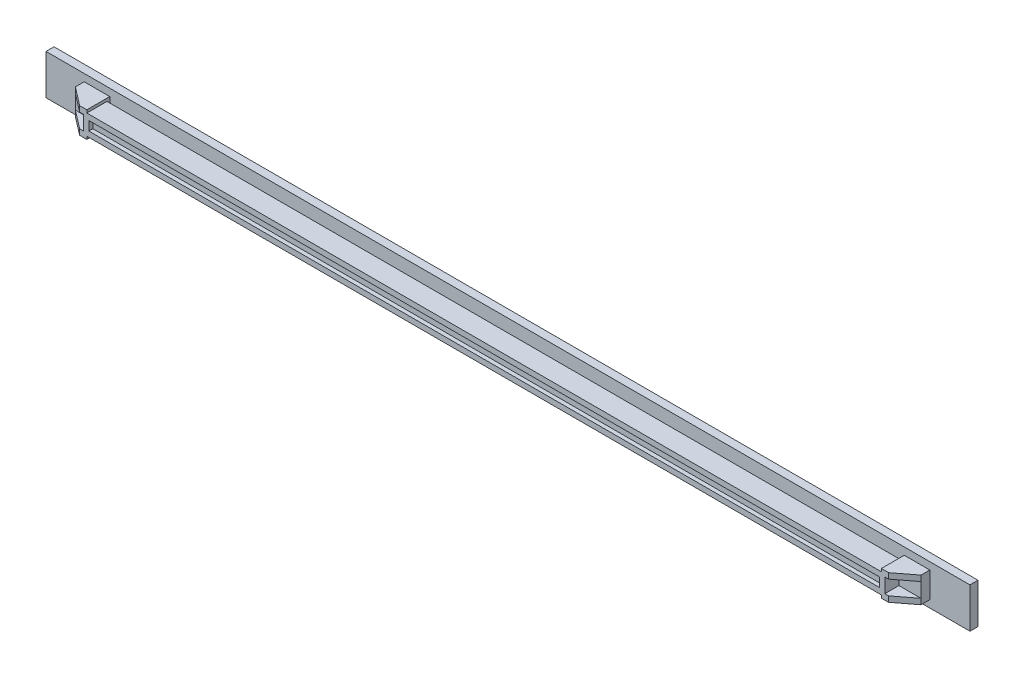
ISO-10303-21;
HEADER;
FILE_DESCRIPTION(('STEP AP214'),'2;1');
FILE_NAME('part.step','',(''),(''),'','','');
FILE_SCHEMA(('AUTOMOTIVE_DESIGN { 1 0 10303 214 1 1 1 1 }'));
ENDSEC;
DATA;
#1=APPLICATION_CONTEXT('core data for automotive mechanical design processes');
#2=APPLICATION_PROTOCOL_DEFINITION('international standard','automotive_design',2000,#1);
#3=PRODUCT_CONTEXT('',#1,'mechanical');
#4=PRODUCT('Part','Part','',(#3));
#5=PRODUCT_RELATED_PRODUCT_CATEGORY('part','',(#4));
#6=PRODUCT_DEFINITION_FORMATION('','',#4);
#7=PRODUCT_DEFINITION_CONTEXT('part definition',#1,'design');
#8=PRODUCT_DEFINITION('design','',#6,#7);
#9=PRODUCT_DEFINITION_SHAPE('','',#8);
#10=(LENGTH_UNIT() NAMED_UNIT(*) SI_UNIT(.MILLI.,.METRE.));
#11=(NAMED_UNIT(*) PLANE_ANGLE_UNIT() SI_UNIT($,.RADIAN.));
#12=(NAMED_UNIT(*) SI_UNIT($,.STERADIAN.) SOLID_ANGLE_UNIT());
#13=UNCERTAINTY_MEASURE_WITH_UNIT(LENGTH_MEASURE(1.E-05),#10,'distance_accuracy_value','');
#14=(GEOMETRIC_REPRESENTATION_CONTEXT(3) GLOBAL_UNCERTAINTY_ASSIGNED_CONTEXT((#13)) GLOBAL_UNIT_ASSIGNED_CONTEXT((#10,
#11,#12)) REPRESENTATION_CONTEXT('',''));
#15=CARTESIAN_POINT('',(0.,0.,0.));
#16=DIRECTION('',(0.,0.,1.));
#17=DIRECTION('',(1.,0.,0.));
#18=AXIS2_PLACEMENT_3D('',#15,#16,#17);
#19=CARTESIAN_POINT('',(1077.4481005517,37.5000000000001,-3.5));
#20=DIRECTION('',(0.,0.,-1.));
#21=DIRECTION('',(-1.,0.,0.));
#22=AXIS2_PLACEMENT_3D('',#19,#20,#21);
#23=PLANE('',#22);
#24=DIRECTION('',(-1.,0.,0.));
#25=VECTOR('',#24,1.);
#26=CARTESIAN_POINT('',(1077.4481005517,37.5000000000001,-3.5));
#27=LINE('',#26,#25);
#28=CARTESIAN_POINT('',(1077.4481005517,37.5000000000001,-3.5));
#29=VERTEX_POINT('',#28);
#30=CARTESIAN_POINT('',(-72.551899448297,37.4999999999999,-3.5));
#31=VERTEX_POINT('',#30);
#32=EDGE_CURVE('E101',#29,#31,#27,.T.);
#33=ORIENTED_EDGE('',*,*,#32,.T.);
#34=DIRECTION('',(0.,-1.,0.));
#35=VECTOR('',#34,1.);
#36=CARTESIAN_POINT('',(-72.551899448297,37.4999999999999,-3.5));
#37=LINE('',#36,#35);
#38=CARTESIAN_POINT('',(-72.551899448297,-12.5000000000001,-3.5));
#39=VERTEX_POINT('',#38);
#40=EDGE_CURVE('E96',#31,#39,#37,.T.);
#41=ORIENTED_EDGE('',*,*,#40,.T.);
#42=DIRECTION('',(-1.,0.,0.));
#43=VECTOR('',#42,1.);
#44=CARTESIAN_POINT('',(1077.4481005517,-12.4999999999999,-3.5));
#45=LINE('',#44,#43);
#46=CARTESIAN_POINT('',(1077.4481005517,-12.4999999999999,-3.5));
#47=VERTEX_POINT('',#46);
#48=EDGE_CURVE('E12',#47,#39,#45,.T.);
#49=ORIENTED_EDGE('',*,*,#48,.F.);
#50=DIRECTION('',(0.,-1.,0.));
#51=VECTOR('',#50,1.);
#52=CARTESIAN_POINT('',(1077.4481005517,37.5000000000001,-3.5));
#53=LINE('',#52,#51);
#54=EDGE_CURVE('E107',#29,#47,#53,.T.);
#55=ORIENTED_EDGE('',*,*,#54,.F.);
#56=EDGE_LOOP('',(#33,#41,#49,#55));
#57=FACE_BOUND('',#56,.T.);
#58=ADVANCED_FACE('F44',(#57),#23,.F.);
#59=CARTESIAN_POINT('',(1077.4481005517,-12.4999999999999,-3.5));
#60=DIRECTION('',(0.,1.,0.));
#61=DIRECTION('',(-1.,0.,0.));
#62=AXIS2_PLACEMENT_3D('',#59,#60,#61);
#63=PLANE('',#62);
#64=ORIENTED_EDGE('',*,*,#48,.T.);
#65=DIRECTION('',(0.,0.,-1.));
#66=VECTOR('',#65,1.);
#67=CARTESIAN_POINT('',(-72.551899448297,-12.5000000000001,-3.5));
#68=LINE('',#67,#66);
#69=CARTESIAN_POINT('',(-72.551899448297,-12.5000000000001,-13.5));
#70=VERTEX_POINT('',#69);
#71=EDGE_CURVE('E86',#39,#70,#68,.T.);
#72=ORIENTED_EDGE('',*,*,#71,.T.);
#73=DIRECTION('',(-1.,0.,0.));
#74=VECTOR('',#73,1.);
#75=CARTESIAN_POINT('',(1077.4481005517,-12.4999999999999,-13.5));
#76=LINE('',#75,#74);
#77=CARTESIAN_POINT('',(1077.4481005517,-12.4999999999999,-13.5));
#78=VERTEX_POINT('',#77);
#79=EDGE_CURVE('E51',#78,#70,#76,.T.);
#80=ORIENTED_EDGE('',*,*,#79,.F.);
#81=DIRECTION('',(0.,0.,-1.));
#82=VECTOR('',#81,1.);
#83=CARTESIAN_POINT('',(1077.4481005517,-12.4999999999999,-3.5));
#84=LINE('',#83,#82);
#85=EDGE_CURVE('E87',#47,#78,#84,.T.);
#86=ORIENTED_EDGE('',*,*,#85,.F.);
#87=EDGE_LOOP('',(#64,#72,#80,#86));
#88=FACE_BOUND('',#87,.T.);
#89=ADVANCED_FACE('F84',(#88),#63,.F.);
#90=CARTESIAN_POINT('',(1077.4481005517,37.5000000000001,-13.5));
#91=DIRECTION('',(0.,0.,1.));
#92=DIRECTION('',(1.,0.,0.));
#93=AXIS2_PLACEMENT_3D('',#90,#91,#92);
#94=PLANE('',#93);
#95=ORIENTED_EDGE('',*,*,#79,.T.);
#96=DIRECTION('',(0.,1.,0.));
#97=VECTOR('',#96,1.);
#98=CARTESIAN_POINT('',(-72.551899448297,37.4999999999999,-13.5));
#99=LINE('',#98,#97);
#100=CARTESIAN_POINT('',(-72.551899448297,37.4999999999999,-13.5));
#101=VERTEX_POINT('',#100);
#102=EDGE_CURVE('E99',#70,#101,#99,.T.);
#103=ORIENTED_EDGE('',*,*,#102,.T.);
#104=DIRECTION('',(-1.,0.,0.));
#105=VECTOR('',#104,1.);
#106=CARTESIAN_POINT('',(1077.4481005517,37.5000000000001,-13.5));
#107=LINE('',#106,#105);
#108=CARTESIAN_POINT('',(1077.4481005517,37.5000000000001,-13.5));
#109=VERTEX_POINT('',#108);
#110=EDGE_CURVE('E113',#109,#101,#107,.T.);
#111=ORIENTED_EDGE('',*,*,#110,.F.);
#112=DIRECTION('',(0.,1.,0.));
#113=VECTOR('',#112,1.);
#114=CARTESIAN_POINT('',(1077.4481005517,37.5000000000001,-13.5));
#115=LINE('',#114,#113);
#116=EDGE_CURVE('E63',#78,#109,#115,.T.);
#117=ORIENTED_EDGE('',*,*,#116,.F.);
#118=EDGE_LOOP('',(#95,#103,#111,#117));
#119=FACE_BOUND('',#118,.T.);
#120=ADVANCED_FACE('F115',(#119),#94,.F.);
#121=CARTESIAN_POINT('',(1077.4481005517,37.5000000000001,-3.5));
#122=DIRECTION('',(0.,-1.,0.));
#123=DIRECTION('',(1.,0.,0.));
#124=AXIS2_PLACEMENT_3D('',#121,#122,#123);
#125=PLANE('',#124);
#126=ORIENTED_EDGE('',*,*,#110,.T.);
#127=DIRECTION('',(0.,0.,1.));
#128=VECTOR('',#127,1.);
#129=CARTESIAN_POINT('',(-72.551899448297,37.4999999999999,-3.5));
#130=LINE('',#129,#128);
#131=EDGE_CURVE('E105',#101,#31,#130,.T.);
#132=ORIENTED_EDGE('',*,*,#131,.T.);
#133=ORIENTED_EDGE('',*,*,#32,.F.);
#134=DIRECTION('',(0.,0.,1.));
#135=VECTOR('',#134,1.);
#136=CARTESIAN_POINT('',(1077.4481005517,37.5000000000001,-3.5));
#137=LINE('',#136,#135);
#138=EDGE_CURVE('E58',#109,#29,#137,.T.);
#139=ORIENTED_EDGE('',*,*,#138,.F.);
#140=EDGE_LOOP('',(#126,#132,#133,#139));
#141=FACE_BOUND('',#140,.T.);
#142=ADVANCED_FACE('F117',(#141),#125,.F.);
#143=CARTESIAN_POINT('',(1077.4481005517,0.,0.));
#144=DIRECTION('',(1.,0.,0.));
#145=DIRECTION('',(0.,0.,-1.));
#146=AXIS2_PLACEMENT_3D('',#143,#144,#145);
#147=PLANE('',#146);
#148=ORIENTED_EDGE('',*,*,#54,.T.);
#149=ORIENTED_EDGE('',*,*,#85,.T.);
#150=ORIENTED_EDGE('',*,*,#116,.T.);
#151=ORIENTED_EDGE('',*,*,#138,.T.);
#152=EDGE_LOOP('',(#148,#149,#150,#151));
#153=FACE_BOUND('',#152,.T.);
#154=ADVANCED_FACE('F118',(#153),#147,.T.);
#155=CARTESIAN_POINT('',(-72.551899448297,-1.32513598859339E-13,0.));
#156=DIRECTION('',(1.,0.,0.));
#157=DIRECTION('',(0.,0.,-1.));
#158=AXIS2_PLACEMENT_3D('',#155,#156,#157);
#159=PLANE('',#158);
#160=ORIENTED_EDGE('',*,*,#40,.F.);
#161=ORIENTED_EDGE('',*,*,#131,.F.);
#162=ORIENTED_EDGE('',*,*,#102,.F.);
#163=ORIENTED_EDGE('',*,*,#71,.F.);
#164=EDGE_LOOP('',(#160,#161,#162,#163));
#165=FACE_BOUND('',#164,.T.);
#166=ADVANCED_FACE('F94',(#165),#159,.F.);
#167=CLOSED_SHELL('',(#58,#89,#120,#142,#154,#166));
#168=MANIFOLD_SOLID_BREP('B2',#167);
#169=CARTESIAN_POINT('',(0.,0.,25.));
#170=DIRECTION('',(0.,1.,0.));
#171=DIRECTION('',(0.,0.,1.));
#172=AXIS2_PLACEMENT_3D('',#169,#170,#171);
#173=PLANE('',#172);
#174=DIRECTION('',(0.,0.,-1.));
#175=VECTOR('',#174,1.);
#176=CARTESIAN_POINT('',(995.648100551703,0.,25.));
#177=LINE('',#176,#175);
#178=CARTESIAN_POINT('',(995.648100551703,0.,25.));
#179=VERTEX_POINT('',#178);
#180=CARTESIAN_POINT('',(995.648100551703,0.,0.));
#181=VERTEX_POINT('',#180);
#182=EDGE_CURVE('E181',#179,#181,#177,.T.);
#183=ORIENTED_EDGE('',*,*,#182,.F.);
#184=DIRECTION('',(1.,0.,0.));
#185=VECTOR('',#184,1.);
#186=CARTESIAN_POINT('',(0.,0.,25.));
#187=LINE('',#186,#185);
#188=CARTESIAN_POINT('',(6.8,0.,25.));
#189=VERTEX_POINT('',#188);
#190=EDGE_CURVE('E539',#189,#179,#187,.T.);
#191=ORIENTED_EDGE('',*,*,#190,.F.);
#192=DIRECTION('',(0.,0.,-1.));
#193=VECTOR('',#192,1.);
#194=CARTESIAN_POINT('',(6.8,0.,25.));
#195=LINE('',#194,#193);
#196=CARTESIAN_POINT('',(6.8,0.,0.));
#197=VERTEX_POINT('',#196);
#198=EDGE_CURVE('E492',#189,#197,#195,.T.);
#199=ORIENTED_EDGE('',*,*,#198,.T.);
#200=DIRECTION('',(1.,0.,0.));
#201=VECTOR('',#200,1.);
#202=CARTESIAN_POINT('',(0.,0.,0.));
#203=LINE('',#202,#201);
#204=EDGE_CURVE('E536',#197,#181,#203,.T.);
#205=ORIENTED_EDGE('',*,*,#204,.T.);
#206=EDGE_LOOP('',(#183,#191,#199,#205));
#207=FACE_BOUND('',#206,.T.);
#208=ADVANCED_FACE('F167',(#207),#173,.F.);
#209=CARTESIAN_POINT('',(0.,25.,25.));
#210=DIRECTION('',(0.,-1.,0.));
#211=DIRECTION('',(0.,0.,-1.));
#212=AXIS2_PLACEMENT_3D('',#209,#210,#211);
#213=PLANE('',#212);
#214=DIRECTION('',(0.,0.,1.));
#215=VECTOR('',#214,1.);
#216=CARTESIAN_POINT('',(995.648100551703,25.0000000000001,0.));
#217=LINE('',#216,#215);
#218=CARTESIAN_POINT('',(995.648100551703,25.0000000000001,0.));
#219=VERTEX_POINT('',#218);
#220=CARTESIAN_POINT('',(995.648100551703,25.0000000000001,25.));
#221=VERTEX_POINT('',#220);
#222=EDGE_CURVE('E404',#219,#221,#217,.T.);
#223=ORIENTED_EDGE('',*,*,#222,.F.);
#224=DIRECTION('',(-1.,0.,0.));
#225=VECTOR('',#224,1.);
#226=CARTESIAN_POINT('',(0.,25.,0.));
#227=LINE('',#226,#225);
#228=CARTESIAN_POINT('',(6.8,25.,0.));
#229=VERTEX_POINT('',#228);
#230=EDGE_CURVE('E541',#219,#229,#227,.T.);
#231=ORIENTED_EDGE('',*,*,#230,.T.);
#232=DIRECTION('',(0.,0.,1.));
#233=VECTOR('',#232,1.);
#234=CARTESIAN_POINT('',(6.8,25.,0.));
#235=LINE('',#234,#233);
#236=CARTESIAN_POINT('',(6.8,25.,25.));
#237=VERTEX_POINT('',#236);
#238=EDGE_CURVE('E487',#229,#237,#235,.T.);
#239=ORIENTED_EDGE('',*,*,#238,.T.);
#240=DIRECTION('',(-1.,0.,0.));
#241=VECTOR('',#240,1.);
#242=CARTESIAN_POINT('',(0.,25.,25.));
#243=LINE('',#242,#241);
#244=EDGE_CURVE('E543',#221,#237,#243,.T.);
#245=ORIENTED_EDGE('',*,*,#244,.F.);
#246=EDGE_LOOP('',(#223,#231,#239,#245));
#247=FACE_BOUND('',#246,.T.);
#248=ADVANCED_FACE('F626',(#247),#213,.F.);
#249=CARTESIAN_POINT('',(0.,0.,0.));
#250=DIRECTION('',(0.,0.,-1.));
#251=DIRECTION('',(-1.,0.,0.));
#252=AXIS2_PLACEMENT_3D('',#249,#250,#251);
#253=PLANE('',#252);
#254=ORIENTED_EDGE('',*,*,#230,.F.);
#255=DIRECTION('',(0.,1.,0.));
#256=VECTOR('',#255,1.);
#257=CARTESIAN_POINT('',(995.648100551703,0.,0.));
#258=LINE('',#257,#256);
#259=EDGE_CURVE('E409',#181,#219,#258,.T.);
#260=ORIENTED_EDGE('',*,*,#259,.F.);
#261=ORIENTED_EDGE('',*,*,#204,.F.);
#262=DIRECTION('',(0.,1.,0.));
#263=VECTOR('',#262,1.);
#264=CARTESIAN_POINT('',(6.8,0.,0.));
#265=LINE('',#264,#263);
#266=EDGE_CURVE('E495',#197,#229,#265,.T.);
#267=ORIENTED_EDGE('',*,*,#266,.T.);
#268=EDGE_LOOP('',(#254,#260,#261,#267));
#269=FACE_BOUND('',#268,.T.);
#270=ADVANCED_FACE('F630',(#269),#253,.T.);
#271=CARTESIAN_POINT('',(993.2,18.2000000000002,20.));
#272=DIRECTION('',(0.,1.,0.));
#273=DIRECTION('',(-1.,0.,0.));
#274=AXIS2_PLACEMENT_3D('',#271,#272,#273);
#275=PLANE('',#274);
#276=DIRECTION('',(-1.,0.,0.));
#277=VECTOR('',#276,1.);
#278=CARTESIAN_POINT('',(993.2,18.2000000000002,25.));
#279=LINE('',#278,#277);
#280=CARTESIAN_POINT('',(993.2,18.2000000000002,25.));
#281=VERTEX_POINT('',#280);
#282=CARTESIAN_POINT('',(9.24810055170333,18.2000000000001,25.));
#283=VERTEX_POINT('',#282);
#284=EDGE_CURVE('E519',#281,#283,#279,.T.);
#285=ORIENTED_EDGE('',*,*,#284,.T.);
#286=DIRECTION('',(0.,0.,1.));
#287=VECTOR('',#286,1.);
#288=CARTESIAN_POINT('',(9.24810055170333,18.2000000000001,20.));
#289=LINE('',#288,#287);
#290=CARTESIAN_POINT('',(9.24810055170333,18.2,20.));
#291=VERTEX_POINT('',#290);
#292=EDGE_CURVE('E352',#291,#283,#289,.T.);
#293=ORIENTED_EDGE('',*,*,#292,.F.);
#294=DIRECTION('',(-1.,0.,0.));
#295=VECTOR('',#294,1.);
#296=CARTESIAN_POINT('',(993.2,18.2000000000002,20.));
#297=LINE('',#296,#295);
#298=CARTESIAN_POINT('',(993.2,18.2000000000002,20.));
#299=VERTEX_POINT('',#298);
#300=EDGE_CURVE('E520',#299,#291,#297,.T.);
#301=ORIENTED_EDGE('',*,*,#300,.F.);
#302=DIRECTION('',(0.,0.,1.));
#303=VECTOR('',#302,1.);
#304=CARTESIAN_POINT('',(993.2,18.2000000000002,20.));
#305=LINE('',#304,#303);
#306=EDGE_CURVE('E534',#299,#281,#305,.T.);
#307=ORIENTED_EDGE('',*,*,#306,.T.);
#308=EDGE_LOOP('',(#285,#293,#301,#307));
#309=FACE_BOUND('',#308,.T.);
#310=ADVANCED_FACE('F636',(#309),#275,.F.);
#311=CARTESIAN_POINT('',(6.8,6.8,20.));
#312=DIRECTION('',(0.,-1.,0.));
#313=DIRECTION('',(1.,0.,0.));
#314=AXIS2_PLACEMENT_3D('',#311,#312,#313);
#315=PLANE('',#314);
#316=DIRECTION('',(1.,0.,0.));
#317=VECTOR('',#316,1.);
#318=CARTESIAN_POINT('',(6.8,6.8,25.));
#319=LINE('',#318,#317);
#320=CARTESIAN_POINT('',(9.24810055170333,6.8,25.));
#321=VERTEX_POINT('',#320);
#322=CARTESIAN_POINT('',(993.2,6.80000000000006,25.));
#323=VERTEX_POINT('',#322);
#324=EDGE_CURVE('E530',#321,#323,#319,.T.);
#325=ORIENTED_EDGE('',*,*,#324,.T.);
#326=DIRECTION('',(0.,0.,1.));
#327=VECTOR('',#326,1.);
#328=CARTESIAN_POINT('',(993.2,6.80000000000006,20.));
#329=LINE('',#328,#327);
#330=CARTESIAN_POINT('',(993.2,6.80000000000006,20.));
#331=VERTEX_POINT('',#330);
#332=EDGE_CURVE('E528',#331,#323,#329,.T.);
#333=ORIENTED_EDGE('',*,*,#332,.F.);
#334=DIRECTION('',(1.,0.,0.));
#335=VECTOR('',#334,1.);
#336=CARTESIAN_POINT('',(6.8,6.8,20.));
#337=LINE('',#336,#335);
#338=CARTESIAN_POINT('',(9.24810055170333,6.8,20.));
#339=VERTEX_POINT('',#338);
#340=EDGE_CURVE('E522',#339,#331,#337,.T.);
#341=ORIENTED_EDGE('',*,*,#340,.F.);
#342=DIRECTION('',(0.,0.,1.));
#343=VECTOR('',#342,1.);
#344=CARTESIAN_POINT('',(9.24810055170333,6.8,20.));
#345=LINE('',#344,#343);
#346=EDGE_CURVE('E435',#339,#321,#345,.T.);
#347=ORIENTED_EDGE('',*,*,#346,.T.);
#348=EDGE_LOOP('',(#325,#333,#341,#347));
#349=FACE_BOUND('',#348,.T.);
#350=ADVANCED_FACE('F666',(#349),#315,.F.);
#351=CARTESIAN_POINT('',(0.,0.,20.));
#352=DIRECTION('',(0.,0.,1.));
#353=DIRECTION('',(1.,0.,0.));
#354=AXIS2_PLACEMENT_3D('',#351,#352,#353);
#355=PLANE('',#354);
#356=ORIENTED_EDGE('',*,*,#300,.T.);
#357=DIRECTION('',(0.,1.,0.));
#358=VECTOR('',#357,1.);
#359=CARTESIAN_POINT('',(9.24810055170333,6.8,20.));
#360=LINE('',#359,#358);
#361=EDGE_CURVE('E189',#339,#291,#360,.T.);
#362=ORIENTED_EDGE('',*,*,#361,.F.);
#363=ORIENTED_EDGE('',*,*,#340,.T.);
#364=DIRECTION('',(0.,1.,0.));
#365=VECTOR('',#364,1.);
#366=CARTESIAN_POINT('',(993.2,6.80000000000006,20.));
#367=LINE('',#366,#365);
#368=EDGE_CURVE('E525',#331,#299,#367,.T.);
#369=ORIENTED_EDGE('',*,*,#368,.T.);
#370=EDGE_LOOP('',(#356,#362,#363,#369));
#371=FACE_BOUND('',#370,.T.);
#372=ADVANCED_FACE('F657',(#371),#355,.T.);
#373=CARTESIAN_POINT('',(-25.,28.5,28.5));
#374=DIRECTION('',(0.,-1.,0.));
#375=DIRECTION('',(0.,0.,-1.));
#376=AXIS2_PLACEMENT_3D('',#373,#374,#375);
#377=PLANE('',#376);
#378=DIRECTION('',(-1.,0.,0.));
#379=VECTOR('',#378,1.);
#380=CARTESIAN_POINT('',(-25.,28.5,25.));
#381=LINE('',#380,#379);
#382=CARTESIAN_POINT('',(6.79999999999999,28.5,25.));
#383=VERTEX_POINT('',#382);
#384=CARTESIAN_POINT('',(-2.12658287358067,28.5,25.));
#385=VERTEX_POINT('',#384);
#386=EDGE_CURVE('E446',#383,#385,#381,.T.);
#387=ORIENTED_EDGE('',*,*,#386,.F.);
#388=DIRECTION('',(0.,0.,1.));
#389=VECTOR('',#388,1.);
#390=CARTESIAN_POINT('',(6.8,28.5,-3.5));
#391=LINE('',#390,#389);
#392=CARTESIAN_POINT('',(6.8,28.5,-3.5));
#393=VERTEX_POINT('',#392);
#394=EDGE_CURVE('E503',#393,#383,#391,.T.);
#395=ORIENTED_EDGE('',*,*,#394,.F.);
#396=DIRECTION('',(1.,0.,0.));
#397=VECTOR('',#396,1.);
#398=CARTESIAN_POINT('',(-25.,28.5,-3.5));
#399=LINE('',#398,#397);
#400=CARTESIAN_POINT('',(-25.,28.5,-3.5));
#401=VERTEX_POINT('',#400);
#402=EDGE_CURVE('E514',#401,#393,#399,.T.);
#403=ORIENTED_EDGE('',*,*,#402,.F.);
#404=DIRECTION('',(0.,0.,-1.));
#405=VECTOR('',#404,1.);
#406=CARTESIAN_POINT('',(-25.,28.5,28.5));
#407=LINE('',#406,#405);
#408=CARTESIAN_POINT('',(-25.,28.5,7.5));
#409=VERTEX_POINT('',#408);
#410=EDGE_CURVE('E512',#409,#401,#407,.T.);
#411=ORIENTED_EDGE('',*,*,#410,.F.);
#412=DIRECTION('',(-0.794214335112172,0.,-0.607637712705796));
#413=VECTOR('',#412,1.);
#414=CARTESIAN_POINT('',(-14.8655137783,28.5,15.2536953879489));
#415=LINE('',#414,#413);
#416=EDGE_CURVE('E469',#385,#409,#415,.T.);
#417=ORIENTED_EDGE('',*,*,#416,.F.);
#418=EDGE_LOOP('',(#387,#395,#403,#411,#417));
#419=FACE_BOUND('',#418,.T.);
#420=ADVANCED_FACE('F557',(#419),#377,.F.);
#421=CARTESIAN_POINT('',(-25.,-3.50000000000001,-3.5));
#422=DIRECTION('',(0.,1.,0.));
#423=DIRECTION('',(0.,0.,1.));
#424=AXIS2_PLACEMENT_3D('',#421,#422,#423);
#425=PLANE('',#424);
#426=DIRECTION('',(1.,0.,0.));
#427=VECTOR('',#426,1.);
#428=CARTESIAN_POINT('',(-25.,-3.50000000000001,25.));
#429=LINE('',#428,#427);
#430=CARTESIAN_POINT('',(-2.12658287358067,-3.5,25.));
#431=VERTEX_POINT('',#430);
#432=CARTESIAN_POINT('',(6.8,-3.50000000000001,25.));
#433=VERTEX_POINT('',#432);
#434=EDGE_CURVE('E452',#431,#433,#429,.T.);
#435=ORIENTED_EDGE('',*,*,#434,.F.);
#436=DIRECTION('',(-0.794214335112172,0.,-0.607637712705796));
#437=VECTOR('',#436,1.);
#438=CARTESIAN_POINT('',(-12.8500491124511,-3.50000000000001,16.7956876253754));
#439=LINE('',#438,#437);
#440=CARTESIAN_POINT('',(-25.,-3.50000000000001,7.5));
#441=VERTEX_POINT('',#440);
#442=EDGE_CURVE('E458',#431,#441,#439,.T.);
#443=ORIENTED_EDGE('',*,*,#442,.T.);
#444=DIRECTION('',(0.,0.,1.));
#445=VECTOR('',#444,1.);
#446=CARTESIAN_POINT('',(-25.,-3.50000000000001,-3.5));
#447=LINE('',#446,#445);
#448=CARTESIAN_POINT('',(-25.,-3.50000000000001,-3.5));
#449=VERTEX_POINT('',#448);
#450=EDGE_CURVE('E509',#449,#441,#447,.T.);
#451=ORIENTED_EDGE('',*,*,#450,.F.);
#452=DIRECTION('',(1.,0.,0.));
#453=VECTOR('',#452,1.);
#454=CARTESIAN_POINT('',(-25.,-3.50000000000001,-3.5));
#455=LINE('',#454,#453);
#456=CARTESIAN_POINT('',(6.8,-3.5,-3.5));
#457=VERTEX_POINT('',#456);
#458=EDGE_CURVE('E516',#449,#457,#455,.T.);
#459=ORIENTED_EDGE('',*,*,#458,.T.);
#460=DIRECTION('',(0.,0.,-1.));
#461=VECTOR('',#460,1.);
#462=CARTESIAN_POINT('',(6.8,-3.5,28.5));
#463=LINE('',#462,#461);
#464=EDGE_CURVE('E498',#433,#457,#463,.T.);
#465=ORIENTED_EDGE('',*,*,#464,.F.);
#466=EDGE_LOOP('',(#435,#443,#451,#459,#465));
#467=FACE_BOUND('',#466,.T.);
#468=ADVANCED_FACE('F584',(#467),#425,.F.);
#469=CARTESIAN_POINT('',(-25.,21.5,7.5));
#470=DIRECTION('',(0.,1.,0.));
#471=DIRECTION('',(0.,0.,1.));
#472=AXIS2_PLACEMENT_3D('',#469,#470,#471);
#473=PLANE('',#472);
#474=DIRECTION('',(1.,0.,0.));
#475=VECTOR('',#474,1.);
#476=CARTESIAN_POINT('',(-25.,21.5,25.));
#477=LINE('',#476,#475);
#478=CARTESIAN_POINT('',(-2.12658287358067,21.5,25.));
#479=VERTEX_POINT('',#478);
#480=CARTESIAN_POINT('',(2.44810055170319,21.5,25.));
#481=VERTEX_POINT('',#480);
#482=EDGE_CURVE('E443',#479,#481,#477,.T.);
#483=ORIENTED_EDGE('',*,*,#482,.F.);
#484=DIRECTION('',(0.794214335112172,0.,0.607637712705796));
#485=VECTOR('',#484,1.);
#486=CARTESIAN_POINT('',(-25.,21.5,7.49999999999999));
#487=LINE('',#486,#485);
#488=CARTESIAN_POINT('',(-25.,21.5,7.5));
#489=VERTEX_POINT('',#488);
#490=EDGE_CURVE('E466',#489,#479,#487,.T.);
#491=ORIENTED_EDGE('',*,*,#490,.F.);
#492=DIRECTION('',(-1.,0.,0.));
#493=VECTOR('',#492,1.);
#494=CARTESIAN_POINT('',(-25.,21.5,7.5));
#495=LINE('',#494,#493);
#496=CARTESIAN_POINT('',(2.44810055170319,21.5,7.5));
#497=VERTEX_POINT('',#496);
#498=EDGE_CURVE('E480',#497,#489,#495,.T.);
#499=ORIENTED_EDGE('',*,*,#498,.F.);
#500=DIRECTION('',(0.,0.,1.));
#501=VECTOR('',#500,1.);
#502=CARTESIAN_POINT('',(2.44810055170319,21.5,7.5));
#503=LINE('',#502,#501);
#504=EDGE_CURVE('E484',#497,#481,#503,.T.);
#505=ORIENTED_EDGE('',*,*,#504,.T.);
#506=EDGE_LOOP('',(#483,#491,#499,#505));
#507=FACE_BOUND('',#506,.T.);
#508=ADVANCED_FACE('F568',(#507),#473,.F.);
#509=CARTESIAN_POINT('',(-25.,3.49999999999999,7.5));
#510=DIRECTION('',(0.,-1.,0.));
#511=DIRECTION('',(0.,0.,-1.));
#512=AXIS2_PLACEMENT_3D('',#509,#510,#511);
#513=PLANE('',#512);
#514=DIRECTION('',(-1.,0.,0.));
#515=VECTOR('',#514,1.);
#516=CARTESIAN_POINT('',(-25.,3.49999999999999,25.));
#517=LINE('',#516,#515);
#518=CARTESIAN_POINT('',(2.44810055170319,3.49999999999999,25.));
#519=VERTEX_POINT('',#518);
#520=CARTESIAN_POINT('',(-2.12658287358067,3.5,25.));
#521=VERTEX_POINT('',#520);
#522=EDGE_CURVE('E450',#519,#521,#517,.T.);
#523=ORIENTED_EDGE('',*,*,#522,.F.);
#524=DIRECTION('',(0.,0.,1.));
#525=VECTOR('',#524,1.);
#526=CARTESIAN_POINT('',(2.44810055170319,3.49999999999999,7.5));
#527=LINE('',#526,#525);
#528=CARTESIAN_POINT('',(2.44810055170319,3.49999999999999,7.5));
#529=VERTEX_POINT('',#528);
#530=EDGE_CURVE('E483',#529,#519,#527,.T.);
#531=ORIENTED_EDGE('',*,*,#530,.F.);
#532=DIRECTION('',(1.,0.,0.));
#533=VECTOR('',#532,1.);
#534=CARTESIAN_POINT('',(-25.,3.49999999999999,7.5));
#535=LINE('',#534,#533);
#536=CARTESIAN_POINT('',(-25.,3.5,7.5));
#537=VERTEX_POINT('',#536);
#538=EDGE_CURVE('E474',#537,#529,#535,.T.);
#539=ORIENTED_EDGE('',*,*,#538,.F.);
#540=DIRECTION('',(-0.794214335112172,0.,-0.607637712705796));
#541=VECTOR('',#540,1.);
#542=CARTESIAN_POINT('',(-25.,3.49999999999999,7.5));
#543=LINE('',#542,#541);
#544=EDGE_CURVE('E464',#521,#537,#543,.T.);
#545=ORIENTED_EDGE('',*,*,#544,.F.);
#546=EDGE_LOOP('',(#523,#531,#539,#545));
#547=FACE_BOUND('',#546,.T.);
#548=ADVANCED_FACE('F578',(#547),#513,.F.);
#549=CARTESIAN_POINT('',(6.8,18.2,20.));
#550=DIRECTION('',(-1.,0.,0.));
#551=DIRECTION('',(0.,-1.,0.));
#552=AXIS2_PLACEMENT_3D('',#549,#550,#551);
#553=PLANE('',#552);
#554=DIRECTION('',(0.,1.,0.));
#555=VECTOR('',#554,1.);
#556=CARTESIAN_POINT('',(6.8,18.2,25.));
#557=LINE('',#556,#555);
#558=EDGE_CURVE('E456',#433,#189,#557,.T.);
#559=ORIENTED_EDGE('',*,*,#558,.F.);
#560=ORIENTED_EDGE('',*,*,#464,.T.);
#561=DIRECTION('',(0.,1.,0.));
#562=VECTOR('',#561,1.);
#563=CARTESIAN_POINT('',(6.8,-3.5,-3.5));
#564=LINE('',#563,#562);
#565=EDGE_CURVE('E500',#457,#393,#564,.T.);
#566=ORIENTED_EDGE('',*,*,#565,.T.);
#567=ORIENTED_EDGE('',*,*,#394,.T.);
#568=DIRECTION('',(0.,1.,0.));
#569=VECTOR('',#568,1.);
#570=CARTESIAN_POINT('',(6.8,18.2,25.));
#571=LINE('',#570,#569);
#572=EDGE_CURVE('E448',#237,#383,#571,.T.);
#573=ORIENTED_EDGE('',*,*,#572,.F.);
#574=ORIENTED_EDGE('',*,*,#238,.F.);
#575=ORIENTED_EDGE('',*,*,#266,.F.);
#576=ORIENTED_EDGE('',*,*,#198,.F.);
#577=EDGE_LOOP('',(#559,#560,#566,#567,#573,#574,#575,#576));
#578=FACE_BOUND('',#577,.T.);
#579=ADVANCED_FACE('F590',(#578),#553,.F.);
#580=CARTESIAN_POINT('',(2.44810055170319,21.5,7.5));
#581=DIRECTION('',(1.,0.,0.));
#582=DIRECTION('',(0.,1.,0.));
#583=AXIS2_PLACEMENT_3D('',#580,#581,#582);
#584=PLANE('',#583);
#585=DIRECTION('',(0.,-1.,0.));
#586=VECTOR('',#585,1.);
#587=CARTESIAN_POINT('',(2.44810055170319,21.5,25.));
#588=LINE('',#587,#586);
#589=EDGE_CURVE('E454',#481,#519,#588,.T.);
#590=ORIENTED_EDGE('',*,*,#589,.F.);
#591=ORIENTED_EDGE('',*,*,#504,.F.);
#592=DIRECTION('',(0.,1.,0.));
#593=VECTOR('',#592,1.);
#594=CARTESIAN_POINT('',(2.44810055170319,21.5,7.5));
#595=LINE('',#594,#593);
#596=EDGE_CURVE('E477',#529,#497,#595,.T.);
#597=ORIENTED_EDGE('',*,*,#596,.F.);
#598=ORIENTED_EDGE('',*,*,#530,.T.);
#599=EDGE_LOOP('',(#590,#591,#597,#598));
#600=FACE_BOUND('',#599,.T.);
#601=ADVANCED_FACE('F574',(#600),#584,.F.);
#602=CARTESIAN_POINT('',(-12.8500491124511,39.5,16.7956876253754));
#603=DIRECTION('',(-0.607637712705796,0.,0.794214335112172));
#604=DIRECTION('',(0.794214335112172,0.,0.607637712705796));
#605=AXIS2_PLACEMENT_3D('',#602,#603,#604);
#606=PLANE('',#605);
#607=ORIENTED_EDGE('',*,*,#442,.F.);
#608=DIRECTION('',(0.,1.,0.));
#609=VECTOR('',#608,1.);
#610=CARTESIAN_POINT('',(-2.12658287358067,39.5,25.));
#611=LINE('',#610,#609);
#612=EDGE_CURVE('E42',#431,#521,#611,.T.);
#613=ORIENTED_EDGE('',*,*,#612,.T.);
#614=ORIENTED_EDGE('',*,*,#544,.T.);
#615=DIRECTION('',(0.,-1.,0.));
#616=VECTOR('',#615,1.);
#617=CARTESIAN_POINT('',(-25.,39.5,7.5));
#618=LINE('',#617,#616);
#619=EDGE_CURVE('E460',#537,#441,#618,.T.);
#620=ORIENTED_EDGE('',*,*,#619,.T.);
#621=EDGE_LOOP('',(#607,#613,#614,#620));
#622=FACE_BOUND('',#621,.T.);
#623=ADVANCED_FACE('F581',(#622),#606,.T.);
#624=ORIENTED_EDGE('',*,*,#490,.T.);
#625=DIRECTION('',(0.,1.,0.));
#626=VECTOR('',#625,1.);
#627=CARTESIAN_POINT('',(-2.12658287358067,39.5,25.));
#628=LINE('',#627,#626);
#629=EDGE_CURVE('E174',#479,#385,#628,.T.);
#630=ORIENTED_EDGE('',*,*,#629,.T.);
#631=ORIENTED_EDGE('',*,*,#416,.T.);
#632=EDGE_CURVE('E463',#409,#489,#618,.T.);
#633=ORIENTED_EDGE('',*,*,#632,.T.);
#634=EDGE_LOOP('',(#624,#630,#631,#633));
#635=FACE_BOUND('',#634,.T.);
#636=ADVANCED_FACE('F550',(#635),#606,.T.);
#637=CARTESIAN_POINT('',(-25.,0.,0.));
#638=DIRECTION('',(-1.,0.,0.));
#639=DIRECTION('',(0.,0.,1.));
#640=AXIS2_PLACEMENT_3D('',#637,#638,#639);
#641=PLANE('',#640);
#642=ORIENTED_EDGE('',*,*,#450,.T.);
#643=ORIENTED_EDGE('',*,*,#619,.F.);
#644=DIRECTION('',(0.,-1.,0.));
#645=VECTOR('',#644,1.);
#646=CARTESIAN_POINT('',(-25.,21.5,7.5));
#647=LINE('',#646,#645);
#648=EDGE_CURVE('E471',#489,#537,#647,.T.);
#649=ORIENTED_EDGE('',*,*,#648,.F.);
#650=ORIENTED_EDGE('',*,*,#632,.F.);
#651=ORIENTED_EDGE('',*,*,#410,.T.);
#652=DIRECTION('',(0.,-1.,0.));
#653=VECTOR('',#652,1.);
#654=CARTESIAN_POINT('',(-25.,28.5,-3.5));
#655=LINE('',#654,#653);
#656=EDGE_CURVE('E506',#401,#449,#655,.T.);
#657=ORIENTED_EDGE('',*,*,#656,.T.);
#658=EDGE_LOOP('',(#642,#643,#649,#650,#651,#657));
#659=FACE_BOUND('',#658,.T.);
#660=ADVANCED_FACE('F562',(#659),#641,.T.);
#661=CARTESIAN_POINT('',(1000.,0.,25.));
#662=DIRECTION('',(-1.,0.,0.));
#663=DIRECTION('',(0.,0.,1.));
#664=AXIS2_PLACEMENT_3D('',#661,#662,#663);
#665=PLANE('',#664);
#666=DIRECTION('',(0.,0.,1.));
#667=VECTOR('',#666,1.);
#668=CARTESIAN_POINT('',(1000.,21.5,7.5));
#669=LINE('',#668,#667);
#670=CARTESIAN_POINT('',(1000.,21.5,7.5));
#671=VERTEX_POINT('',#670);
#672=CARTESIAN_POINT('',(1000.,21.5,25.));
#673=VERTEX_POINT('',#672);
#674=EDGE_CURVE('E402',#671,#673,#669,.T.);
#675=ORIENTED_EDGE('',*,*,#674,.T.);
#676=DIRECTION('',(0.,1.,0.));
#677=VECTOR('',#676,1.);
#678=CARTESIAN_POINT('',(1000.,0.,25.));
#679=LINE('',#678,#677);
#680=CARTESIAN_POINT('',(1000.,3.50000000000005,25.));
#681=VERTEX_POINT('',#680);
#682=EDGE_CURVE('E368',#681,#673,#679,.T.);
#683=ORIENTED_EDGE('',*,*,#682,.F.);
#684=DIRECTION('',(0.,0.,1.));
#685=VECTOR('',#684,1.);
#686=CARTESIAN_POINT('',(1000.,3.50000000000005,7.5));
#687=LINE('',#686,#685);
#688=CARTESIAN_POINT('',(1000.,3.50000000000005,7.5));
#689=VERTEX_POINT('',#688);
#690=EDGE_CURVE('E401',#689,#681,#687,.T.);
#691=ORIENTED_EDGE('',*,*,#690,.F.);
#692=DIRECTION('',(0.,1.,0.));
#693=VECTOR('',#692,1.);
#694=CARTESIAN_POINT('',(1000.,21.5,7.5));
#695=LINE('',#694,#693);
#696=EDGE_CURVE('E397',#689,#671,#695,.T.);
#697=ORIENTED_EDGE('',*,*,#696,.T.);
#698=EDGE_LOOP('',(#675,#683,#691,#697));
#699=FACE_BOUND('',#698,.T.);
#700=ADVANCED_FACE('F612',(#699),#665,.F.);
#701=CARTESIAN_POINT('',(0.,0.,25.));
#702=DIRECTION('',(0.,0.,-1.));
#703=DIRECTION('',(-1.,0.,0.));
#704=AXIS2_PLACEMENT_3D('',#701,#702,#703);
#705=PLANE('',#704);
#706=ORIENTED_EDGE('',*,*,#190,.T.);
#707=DIRECTION('',(0.,1.,0.));
#708=VECTOR('',#707,1.);
#709=CARTESIAN_POINT('',(995.648100551703,18.2000000000001,25.));
#710=LINE('',#709,#708);
#711=CARTESIAN_POINT('',(995.648100551703,-3.49999999999995,25.));
#712=VERTEX_POINT('',#711);
#713=EDGE_CURVE('E381',#712,#179,#710,.T.);
#714=ORIENTED_EDGE('',*,*,#713,.F.);
#715=DIRECTION('',(-1.,0.,0.));
#716=VECTOR('',#715,1.);
#717=CARTESIAN_POINT('',(1027.4481005517,-3.49999999999994,25.));
#718=LINE('',#717,#716);
#719=CARTESIAN_POINT('',(1004.57468342528,-3.49999999999994,25.));
#720=VERTEX_POINT('',#719);
#721=EDGE_CURVE('E378',#720,#712,#718,.T.);
#722=ORIENTED_EDGE('',*,*,#721,.F.);
#723=DIRECTION('',(0.,1.,0.));
#724=VECTOR('',#723,1.);
#725=CARTESIAN_POINT('',(1004.57468342528,39.5000000000001,25.));
#726=LINE('',#725,#724);
#727=CARTESIAN_POINT('',(1004.57468342528,3.50000000000006,25.));
#728=VERTEX_POINT('',#727);
#729=EDGE_CURVE('E351',#720,#728,#726,.T.);
#730=ORIENTED_EDGE('',*,*,#729,.T.);
#731=DIRECTION('',(1.,0.,0.));
#732=VECTOR('',#731,1.);
#733=CARTESIAN_POINT('',(1027.4481005517,3.50000000000006,25.));
#734=LINE('',#733,#732);
#735=EDGE_CURVE('E375',#681,#728,#734,.T.);
#736=ORIENTED_EDGE('',*,*,#735,.F.);
#737=ORIENTED_EDGE('',*,*,#682,.T.);
#738=DIRECTION('',(-1.,0.,0.));
#739=VECTOR('',#738,1.);
#740=CARTESIAN_POINT('',(1027.4481005517,21.5000000000001,25.));
#741=LINE('',#740,#739);
#742=CARTESIAN_POINT('',(1004.57468342528,21.5,25.));
#743=VERTEX_POINT('',#742);
#744=EDGE_CURVE('E358',#743,#673,#741,.T.);
#745=ORIENTED_EDGE('',*,*,#744,.F.);
#746=DIRECTION('',(0.,1.,0.));
#747=VECTOR('',#746,1.);
#748=CARTESIAN_POINT('',(1004.57468342528,39.5000000000001,25.));
#749=LINE('',#748,#747);
#750=CARTESIAN_POINT('',(1004.57468342528,28.5000000000001,25.));
#751=VERTEX_POINT('',#750);
#752=EDGE_CURVE('E340',#743,#751,#749,.T.);
#753=ORIENTED_EDGE('',*,*,#752,.T.);
#754=DIRECTION('',(1.,0.,0.));
#755=VECTOR('',#754,1.);
#756=CARTESIAN_POINT('',(1027.4481005517,28.5000000000001,25.));
#757=LINE('',#756,#755);
#758=CARTESIAN_POINT('',(995.648100551703,28.5000000000001,25.));
#759=VERTEX_POINT('',#758);
#760=EDGE_CURVE('E369',#759,#751,#757,.T.);
#761=ORIENTED_EDGE('',*,*,#760,.F.);
#762=DIRECTION('',(0.,1.,0.));
#763=VECTOR('',#762,1.);
#764=CARTESIAN_POINT('',(995.648100551703,18.2000000000001,25.));
#765=LINE('',#764,#763);
#766=EDGE_CURVE('E371',#221,#759,#765,.T.);
#767=ORIENTED_EDGE('',*,*,#766,.F.);
#768=ORIENTED_EDGE('',*,*,#244,.T.);
#769=ORIENTED_EDGE('',*,*,#572,.T.);
#770=ORIENTED_EDGE('',*,*,#386,.T.);
#771=ORIENTED_EDGE('',*,*,#629,.F.);
#772=ORIENTED_EDGE('',*,*,#482,.T.);
#773=ORIENTED_EDGE('',*,*,#589,.T.);
#774=ORIENTED_EDGE('',*,*,#522,.T.);
#775=ORIENTED_EDGE('',*,*,#612,.F.);
#776=ORIENTED_EDGE('',*,*,#434,.T.);
#777=ORIENTED_EDGE('',*,*,#558,.T.);
#778=EDGE_LOOP('',(#706,#714,#722,#730,#736,#737,#745,#753,#761,#767,#768,#769,#770,#771,#772,
#773,#774,#775,#776,#777));
#779=FACE_BOUND('',#778,.T.);
#780=DIRECTION('',(0.,1.,0.));
#781=VECTOR('',#780,1.);
#782=CARTESIAN_POINT('',(993.2,6.80000000000006,25.));
#783=LINE('',#782,#781);
#784=EDGE_CURVE('E523',#323,#281,#783,.T.);
#785=ORIENTED_EDGE('',*,*,#784,.F.);
#786=ORIENTED_EDGE('',*,*,#324,.F.);
#787=DIRECTION('',(0.,1.,0.));
#788=VECTOR('',#787,1.);
#789=CARTESIAN_POINT('',(9.24810055170333,6.8,25.));
#790=LINE('',#789,#788);
#791=EDGE_CURVE('E433',#321,#283,#790,.T.);
#792=ORIENTED_EDGE('',*,*,#791,.T.);
#793=ORIENTED_EDGE('',*,*,#284,.F.);
#794=EDGE_LOOP('',(#785,#786,#792,#793));
#795=FACE_BOUND('',#794,.T.);
#796=ADVANCED_FACE('F364',(#779,#795),#705,.F.);
#797=CARTESIAN_POINT('',(993.2,6.80000000000006,20.));
#798=DIRECTION('',(1.,0.,0.));
#799=DIRECTION('',(0.,0.,-1.));
#800=AXIS2_PLACEMENT_3D('',#797,#798,#799);
#801=PLANE('',#800);
#802=ORIENTED_EDGE('',*,*,#784,.T.);
#803=ORIENTED_EDGE('',*,*,#306,.F.);
#804=ORIENTED_EDGE('',*,*,#368,.F.);
#805=ORIENTED_EDGE('',*,*,#332,.T.);
#806=EDGE_LOOP('',(#802,#803,#804,#805));
#807=FACE_BOUND('',#806,.T.);
#808=ADVANCED_FACE('F646',(#807),#801,.F.);
#809=CARTESIAN_POINT('',(-25.,28.5,-3.5));
#810=DIRECTION('',(0.,0.,1.));
#811=DIRECTION('',(1.,0.,0.));
#812=AXIS2_PLACEMENT_3D('',#809,#810,#811);
#813=PLANE('',#812);
#814=ORIENTED_EDGE('',*,*,#402,.T.);
#815=ORIENTED_EDGE('',*,*,#565,.F.);
#816=ORIENTED_EDGE('',*,*,#458,.F.);
#817=ORIENTED_EDGE('',*,*,#656,.F.);
#818=EDGE_LOOP('',(#814,#815,#816,#817));
#819=FACE_BOUND('',#818,.T.);
#820=ADVANCED_FACE('F660',(#819),#813,.F.);
#821=CARTESIAN_POINT('',(0.,0.,7.5));
#822=DIRECTION('',(0.,0.,1.));
#823=DIRECTION('',(1.,0.,0.));
#824=AXIS2_PLACEMENT_3D('',#821,#822,#823);
#825=PLANE('',#824);
#826=ORIENTED_EDGE('',*,*,#648,.T.);
#827=ORIENTED_EDGE('',*,*,#538,.T.);
#828=ORIENTED_EDGE('',*,*,#596,.T.);
#829=ORIENTED_EDGE('',*,*,#498,.T.);
#830=EDGE_LOOP('',(#826,#827,#828,#829));
#831=FACE_BOUND('',#830,.T.);
#832=ADVANCED_FACE('F570',(#831),#825,.T.);
#833=CARTESIAN_POINT('',(9.24810055170333,6.8,20.));
#834=DIRECTION('',(-1.,0.,0.));
#835=DIRECTION('',(0.,0.,-1.));
#836=AXIS2_PLACEMENT_3D('',#833,#834,#835);
#837=PLANE('',#836);
#838=ORIENTED_EDGE('',*,*,#791,.F.);
#839=ORIENTED_EDGE('',*,*,#346,.F.);
#840=ORIENTED_EDGE('',*,*,#361,.T.);
#841=ORIENTED_EDGE('',*,*,#292,.T.);
#842=EDGE_LOOP('',(#838,#839,#840,#841));
#843=FACE_BOUND('',#842,.T.);
#844=ADVANCED_FACE('F684',(#843),#837,.F.);
#845=CARTESIAN_POINT('',(1027.4481005517,28.5000000000001,28.5));
#846=DIRECTION('',(0.,-1.,0.));
#847=DIRECTION('',(0.,0.,-1.));
#848=AXIS2_PLACEMENT_3D('',#845,#846,#847);
#849=PLANE('',#848);
#850=ORIENTED_EDGE('',*,*,#760,.T.);
#851=DIRECTION('',(0.794214335112172,0.,-0.607637712705796));
#852=VECTOR('',#851,1.);
#853=CARTESIAN_POINT('',(1017.31361433,28.5000000000001,15.2536953879489));
#854=LINE('',#853,#852);
#855=CARTESIAN_POINT('',(1027.4481005517,28.5000000000001,7.5));
#856=VERTEX_POINT('',#855);
#857=EDGE_CURVE('E346',#751,#856,#854,.T.);
#858=ORIENTED_EDGE('',*,*,#857,.T.);
#859=DIRECTION('',(0.,0.,-1.));
#860=VECTOR('',#859,1.);
#861=CARTESIAN_POINT('',(1027.4481005517,28.5000000000001,28.5));
#862=LINE('',#861,#860);
#863=CARTESIAN_POINT('',(1027.4481005517,28.5000000000001,-3.5));
#864=VERTEX_POINT('',#863);
#865=EDGE_CURVE('E424',#856,#864,#862,.T.);
#866=ORIENTED_EDGE('',*,*,#865,.T.);
#867=DIRECTION('',(-1.,0.,0.));
#868=VECTOR('',#867,1.);
#869=CARTESIAN_POINT('',(1027.4481005517,28.5000000000001,-3.5));
#870=LINE('',#869,#868);
#871=CARTESIAN_POINT('',(995.648100551703,28.5000000000001,-3.5));
#872=VERTEX_POINT('',#871);
#873=EDGE_CURVE('E427',#864,#872,#870,.T.);
#874=ORIENTED_EDGE('',*,*,#873,.T.);
#875=DIRECTION('',(0.,0.,1.));
#876=VECTOR('',#875,1.);
#877=CARTESIAN_POINT('',(995.648100551703,28.5000000000001,-3.5));
#878=LINE('',#877,#876);
#879=EDGE_CURVE('E416',#872,#759,#878,.T.);
#880=ORIENTED_EDGE('',*,*,#879,.T.);
#881=EDGE_LOOP('',(#850,#858,#866,#874,#880));
#882=FACE_BOUND('',#881,.T.);
#883=ADVANCED_FACE('F689',(#882),#849,.F.);
#884=CARTESIAN_POINT('',(1027.4481005517,-3.49999999999994,-3.5));
#885=DIRECTION('',(0.,1.,0.));
#886=DIRECTION('',(0.,0.,1.));
#887=AXIS2_PLACEMENT_3D('',#884,#885,#886);
#888=PLANE('',#887);
#889=ORIENTED_EDGE('',*,*,#721,.T.);
#890=DIRECTION('',(0.,0.,-1.));
#891=VECTOR('',#890,1.);
#892=CARTESIAN_POINT('',(995.648100551703,-3.49999999999994,28.5));
#893=LINE('',#892,#891);
#894=CARTESIAN_POINT('',(995.648100551703,-3.49999999999994,-3.5));
#895=VERTEX_POINT('',#894);
#896=EDGE_CURVE('E411',#712,#895,#893,.T.);
#897=ORIENTED_EDGE('',*,*,#896,.T.);
#898=DIRECTION('',(-1.,0.,0.));
#899=VECTOR('',#898,1.);
#900=CARTESIAN_POINT('',(1027.4481005517,-3.49999999999994,-3.5));
#901=LINE('',#900,#899);
#902=CARTESIAN_POINT('',(1027.4481005517,-3.49999999999994,-3.5));
#903=VERTEX_POINT('',#902);
#904=EDGE_CURVE('E430',#903,#895,#901,.T.);
#905=ORIENTED_EDGE('',*,*,#904,.F.);
#906=DIRECTION('',(0.,0.,1.));
#907=VECTOR('',#906,1.);
#908=CARTESIAN_POINT('',(1027.4481005517,-3.49999999999994,-3.5));
#909=LINE('',#908,#907);
#910=CARTESIAN_POINT('',(1027.4481005517,-3.49999999999994,7.5));
#911=VERTEX_POINT('',#910);
#912=EDGE_CURVE('E421',#903,#911,#909,.T.);
#913=ORIENTED_EDGE('',*,*,#912,.T.);
#914=DIRECTION('',(0.794214335112172,0.,-0.607637712705796));
#915=VECTOR('',#914,1.);
#916=CARTESIAN_POINT('',(1015.29814966415,-3.49999999999994,16.7956876253754));
#917=LINE('',#916,#915);
#918=EDGE_CURVE('E383',#720,#911,#917,.T.);
#919=ORIENTED_EDGE('',*,*,#918,.F.);
#920=EDGE_LOOP('',(#889,#897,#905,#913,#919));
#921=FACE_BOUND('',#920,.T.);
#922=ADVANCED_FACE('F602',(#921),#888,.F.);
#923=CARTESIAN_POINT('',(1027.4481005517,21.5000000000001,7.5));
#924=DIRECTION('',(0.,1.,0.));
#925=DIRECTION('',(0.,0.,1.));
#926=AXIS2_PLACEMENT_3D('',#923,#924,#925);
#927=PLANE('',#926);
#928=ORIENTED_EDGE('',*,*,#744,.T.);
#929=ORIENTED_EDGE('',*,*,#674,.F.);
#930=DIRECTION('',(1.,0.,0.));
#931=VECTOR('',#930,1.);
#932=CARTESIAN_POINT('',(1027.4481005517,21.5000000000001,7.5));
#933=LINE('',#932,#931);
#934=CARTESIAN_POINT('',(1027.4481005517,21.5000000000001,7.5));
#935=VERTEX_POINT('',#934);
#936=EDGE_CURVE('E360',#671,#935,#933,.T.);
#937=ORIENTED_EDGE('',*,*,#936,.T.);
#938=DIRECTION('',(-0.794214335112172,0.,0.607637712705796));
#939=VECTOR('',#938,1.);
#940=CARTESIAN_POINT('',(1027.4481005517,21.5000000000001,7.49999999999999));
#941=LINE('',#940,#939);
#942=EDGE_CURVE('E343',#935,#743,#941,.T.);
#943=ORIENTED_EDGE('',*,*,#942,.T.);
#944=EDGE_LOOP('',(#928,#929,#937,#943));
#945=FACE_BOUND('',#944,.T.);
#946=ADVANCED_FACE('F356',(#945),#927,.F.);
#947=CARTESIAN_POINT('',(1027.4481005517,3.50000000000006,7.5));
#948=DIRECTION('',(0.,-1.,0.));
#949=DIRECTION('',(0.,0.,-1.));
#950=AXIS2_PLACEMENT_3D('',#947,#948,#949);
#951=PLANE('',#950);
#952=ORIENTED_EDGE('',*,*,#735,.T.);
#953=DIRECTION('',(0.794214335112172,0.,-0.607637712705796));
#954=VECTOR('',#953,1.);
#955=CARTESIAN_POINT('',(1027.4481005517,3.50000000000006,7.5));
#956=LINE('',#955,#954);
#957=CARTESIAN_POINT('',(1027.4481005517,3.50000000000006,7.5));
#958=VERTEX_POINT('',#957);
#959=EDGE_CURVE('E361',#728,#958,#956,.T.);
#960=ORIENTED_EDGE('',*,*,#959,.T.);
#961=DIRECTION('',(-1.,0.,0.));
#962=VECTOR('',#961,1.);
#963=CARTESIAN_POINT('',(1027.4481005517,3.50000000000006,7.5));
#964=LINE('',#963,#962);
#965=EDGE_CURVE('E394',#958,#689,#964,.T.);
#966=ORIENTED_EDGE('',*,*,#965,.T.);
#967=ORIENTED_EDGE('',*,*,#690,.T.);
#968=EDGE_LOOP('',(#952,#960,#966,#967));
#969=FACE_BOUND('',#968,.T.);
#970=ADVANCED_FACE('F615',(#969),#951,.F.);
#971=CARTESIAN_POINT('',(995.648100551703,18.2000000000001,20.));
#972=DIRECTION('',(1.,0.,0.));
#973=DIRECTION('',(0.,-1.,0.));
#974=AXIS2_PLACEMENT_3D('',#971,#972,#973);
#975=PLANE('',#974);
#976=ORIENTED_EDGE('',*,*,#713,.T.);
#977=ORIENTED_EDGE('',*,*,#182,.T.);
#978=ORIENTED_EDGE('',*,*,#259,.T.);
#979=ORIENTED_EDGE('',*,*,#222,.T.);
#980=ORIENTED_EDGE('',*,*,#766,.T.);
#981=ORIENTED_EDGE('',*,*,#879,.F.);
#982=DIRECTION('',(0.,1.,0.));
#983=VECTOR('',#982,1.);
#984=CARTESIAN_POINT('',(995.648100551703,-3.49999999999994,-3.5));
#985=LINE('',#984,#983);
#986=EDGE_CURVE('E414',#895,#872,#985,.T.);
#987=ORIENTED_EDGE('',*,*,#986,.F.);
#988=ORIENTED_EDGE('',*,*,#896,.F.);
#989=EDGE_LOOP('',(#976,#977,#978,#979,#980,#981,#987,#988));
#990=FACE_BOUND('',#989,.T.);
#991=ADVANCED_FACE('F597',(#990),#975,.F.);
#992=CARTESIAN_POINT('',(1015.29814966415,39.5000000000001,16.7956876253754));
#993=DIRECTION('',(0.607637712705796,0.,0.794214335112172));
#994=DIRECTION('',(-0.794214335112172,0.,0.607637712705796));
#995=AXIS2_PLACEMENT_3D('',#992,#993,#994);
#996=PLANE('',#995);
#997=ORIENTED_EDGE('',*,*,#918,.T.);
#998=DIRECTION('',(0.,-1.,0.));
#999=VECTOR('',#998,1.);
#1000=CARTESIAN_POINT('',(1027.4481005517,39.5000000000001,7.5));
#1001=LINE('',#1000,#999);
#1002=EDGE_CURVE('E386',#958,#911,#1001,.T.);
#1003=ORIENTED_EDGE('',*,*,#1002,.F.);
#1004=ORIENTED_EDGE('',*,*,#959,.F.);
#1005=ORIENTED_EDGE('',*,*,#729,.F.);
#1006=EDGE_LOOP('',(#997,#1003,#1004,#1005));
#1007=FACE_BOUND('',#1006,.T.);
#1008=ADVANCED_FACE('F606',(#1007),#996,.T.);
#1009=ORIENTED_EDGE('',*,*,#942,.F.);
#1010=EDGE_CURVE('E388',#856,#935,#1001,.T.);
#1011=ORIENTED_EDGE('',*,*,#1010,.F.);
#1012=ORIENTED_EDGE('',*,*,#857,.F.);
#1013=ORIENTED_EDGE('',*,*,#752,.F.);
#1014=EDGE_LOOP('',(#1009,#1011,#1012,#1013));
#1015=FACE_BOUND('',#1014,.T.);
#1016=ADVANCED_FACE('F342',(#1015),#996,.T.);
#1017=CARTESIAN_POINT('',(1027.4481005517,0.,0.));
#1018=DIRECTION('',(1.,0.,0.));
#1019=DIRECTION('',(0.,0.,1.));
#1020=AXIS2_PLACEMENT_3D('',#1017,#1018,#1019);
#1021=PLANE('',#1020);
#1022=ORIENTED_EDGE('',*,*,#912,.F.);
#1023=DIRECTION('',(0.,-1.,0.));
#1024=VECTOR('',#1023,1.);
#1025=CARTESIAN_POINT('',(1027.4481005517,28.5000000000001,-3.5));
#1026=LINE('',#1025,#1024);
#1027=EDGE_CURVE('E419',#864,#903,#1026,.T.);
#1028=ORIENTED_EDGE('',*,*,#1027,.F.);
#1029=ORIENTED_EDGE('',*,*,#865,.F.);
#1030=ORIENTED_EDGE('',*,*,#1010,.T.);
#1031=DIRECTION('',(0.,-1.,0.));
#1032=VECTOR('',#1031,1.);
#1033=CARTESIAN_POINT('',(1027.4481005517,21.5000000000001,7.5));
#1034=LINE('',#1033,#1032);
#1035=EDGE_CURVE('E392',#935,#958,#1034,.T.);
#1036=ORIENTED_EDGE('',*,*,#1035,.T.);
#1037=ORIENTED_EDGE('',*,*,#1002,.T.);
#1038=EDGE_LOOP('',(#1022,#1028,#1029,#1030,#1036,#1037));
#1039=FACE_BOUND('',#1038,.T.);
#1040=ADVANCED_FACE('F887',(#1039),#1021,.T.);
#1041=CARTESIAN_POINT('',(1027.4481005517,28.5000000000001,-3.5));
#1042=DIRECTION('',(0.,0.,1.));
#1043=DIRECTION('',(-1.,0.,0.));
#1044=AXIS2_PLACEMENT_3D('',#1041,#1042,#1043);
#1045=PLANE('',#1044);
#1046=ORIENTED_EDGE('',*,*,#873,.F.);
#1047=ORIENTED_EDGE('',*,*,#1027,.T.);
#1048=ORIENTED_EDGE('',*,*,#904,.T.);
#1049=ORIENTED_EDGE('',*,*,#986,.T.);
#1050=EDGE_LOOP('',(#1046,#1047,#1048,#1049));
#1051=FACE_BOUND('',#1050,.T.);
#1052=ADVANCED_FACE('F699',(#1051),#1045,.F.);
#1053=CARTESIAN_POINT('',(1002.4481005517,0.,7.5));
#1054=DIRECTION('',(0.,0.,1.));
#1055=DIRECTION('',(-1.,0.,0.));
#1056=AXIS2_PLACEMENT_3D('',#1053,#1054,#1055);
#1057=PLANE('',#1056);
#1058=ORIENTED_EDGE('',*,*,#1035,.F.);
#1059=ORIENTED_EDGE('',*,*,#936,.F.);
#1060=ORIENTED_EDGE('',*,*,#696,.F.);
#1061=ORIENTED_EDGE('',*,*,#965,.F.);
#1062=EDGE_LOOP('',(#1058,#1059,#1060,#1061));
#1063=FACE_BOUND('',#1062,.T.);
#1064=ADVANCED_FACE('F614',(#1063),#1057,.T.);
#1065=CLOSED_SHELL('',(#208,#248,#270,#310,#350,#372,#420,#468,#508,#548,#579,#601,#623,#636,
#660,#700,#796,#808,#820,#832,#844,#883,#922,#946,#970,#991,#1008,#1016,#1040,#1052,#1064));
#1066=MANIFOLD_SOLID_BREP('B6',#1065);
#1067=ADVANCED_BREP_SHAPE_REPRESENTATION('',(#18,#168,#1066),#14);
#1068=SHAPE_DEFINITION_REPRESENTATION(#9,#1067);
ENDSEC;
END-ISO-10303-21;
